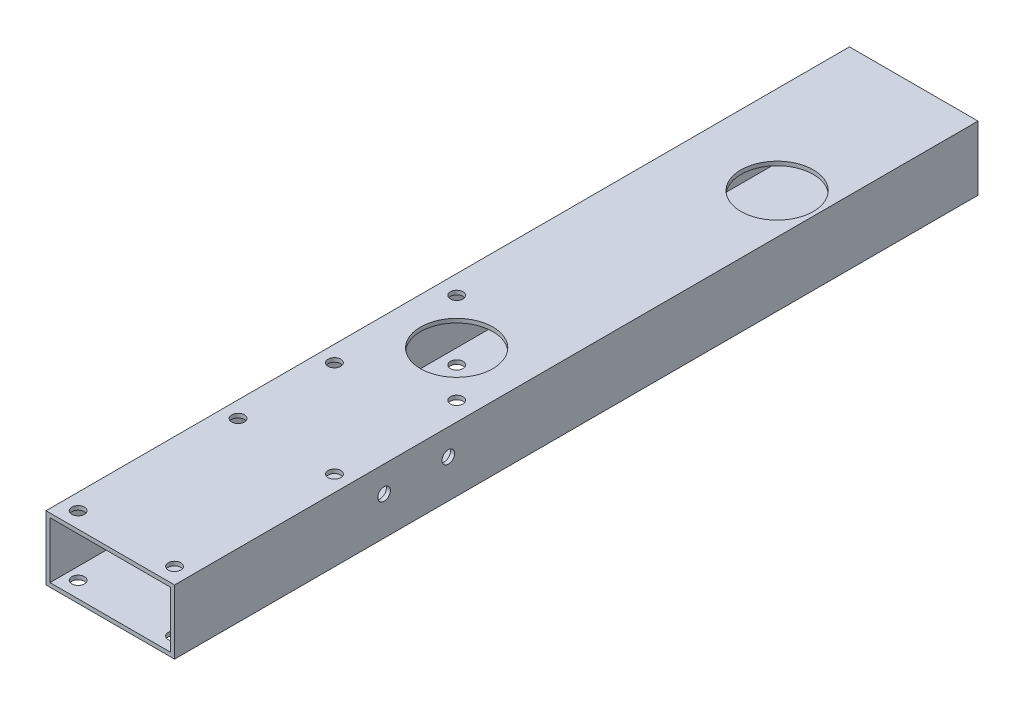
ISO-10303-21;
HEADER;
FILE_DESCRIPTION(('STEP AP214'),'2;1');
FILE_NAME('part.step','',(''),(''),'','','');
FILE_SCHEMA(('AUTOMOTIVE_DESIGN { 1 0 10303 214 1 1 1 1 }'));
ENDSEC;
DATA;
#1=APPLICATION_CONTEXT('core data for automotive mechanical design processes');
#2=APPLICATION_PROTOCOL_DEFINITION('international standard','automotive_design',2000,#1);
#3=PRODUCT_CONTEXT('',#1,'mechanical');
#4=PRODUCT('Part','Part','',(#3));
#5=PRODUCT_RELATED_PRODUCT_CATEGORY('part','',(#4));
#6=PRODUCT_DEFINITION_FORMATION('','',#4);
#7=PRODUCT_DEFINITION_CONTEXT('part definition',#1,'design');
#8=PRODUCT_DEFINITION('design','',#6,#7);
#9=PRODUCT_DEFINITION_SHAPE('','',#8);
#10=(LENGTH_UNIT() NAMED_UNIT(*) SI_UNIT(.MILLI.,.METRE.));
#11=(NAMED_UNIT(*) PLANE_ANGLE_UNIT() SI_UNIT($,.RADIAN.));
#12=(NAMED_UNIT(*) SI_UNIT($,.STERADIAN.) SOLID_ANGLE_UNIT());
#13=UNCERTAINTY_MEASURE_WITH_UNIT(LENGTH_MEASURE(1.E-05),#10,'distance_accuracy_value','');
#14=(GEOMETRIC_REPRESENTATION_CONTEXT(3) GLOBAL_UNCERTAINTY_ASSIGNED_CONTEXT((#13)) GLOBAL_UNIT_ASSIGNED_CONTEXT((#10,
#11,#12)) REPRESENTATION_CONTEXT('',''));
#15=CARTESIAN_POINT('',(0.,0.,0.));
#16=DIRECTION('',(0.,0.,1.));
#17=DIRECTION('',(1.,0.,0.));
#18=AXIS2_PLACEMENT_3D('',#15,#16,#17);
#19=CARTESIAN_POINT('',(0.,0.,158.750000508));
#20=DIRECTION('',(0.,0.,1.));
#21=DIRECTION('',(1.,0.,0.));
#22=AXIS2_PLACEMENT_3D('',#19,#20,#21);
#23=PLANE('',#22);
#24=DIRECTION('',(0.,-1.,0.));
#25=VECTOR('',#24,1.);
#26=CARTESIAN_POINT('',(-25.4,12.7,158.750000508));
#27=LINE('',#26,#25);
#28=CARTESIAN_POINT('',(-25.4,12.7,158.750000508));
#29=VERTEX_POINT('',#28);
#30=CARTESIAN_POINT('',(-25.4,-12.7,158.750000508));
#31=VERTEX_POINT('',#30);
#32=EDGE_CURVE('E118',#29,#31,#27,.T.);
#33=ORIENTED_EDGE('',*,*,#32,.T.);
#34=DIRECTION('',(1.,0.,0.));
#35=VECTOR('',#34,1.);
#36=CARTESIAN_POINT('',(-25.4,-12.7,158.750000508));
#37=LINE('',#36,#35);
#38=CARTESIAN_POINT('',(25.4,-12.7,158.750000508));
#39=VERTEX_POINT('',#38);
#40=EDGE_CURVE('E173',#31,#39,#37,.T.);
#41=ORIENTED_EDGE('',*,*,#40,.T.);
#42=DIRECTION('',(0.,1.,0.));
#43=VECTOR('',#42,1.);
#44=CARTESIAN_POINT('',(25.4,-12.7,158.750000508));
#45=LINE('',#44,#43);
#46=CARTESIAN_POINT('',(25.4,12.7,158.750000508));
#47=VERTEX_POINT('',#46);
#48=EDGE_CURVE('E175',#39,#47,#45,.T.);
#49=ORIENTED_EDGE('',*,*,#48,.T.);
#50=DIRECTION('',(-1.,0.,0.));
#51=VECTOR('',#50,1.);
#52=CARTESIAN_POINT('',(25.4,12.7,158.750000508));
#53=LINE('',#52,#51);
#54=EDGE_CURVE('E177',#47,#29,#53,.T.);
#55=ORIENTED_EDGE('',*,*,#54,.T.);
#56=EDGE_LOOP('',(#33,#41,#49,#55));
#57=FACE_BOUND('',#56,.T.);
#58=DIRECTION('',(1.,0.,0.));
#59=VECTOR('',#58,1.);
#60=CARTESIAN_POINT('',(-23.8125,-11.1125,158.750000508));
#61=LINE('',#60,#59);
#62=CARTESIAN_POINT('',(-23.8125,-11.1125,158.750000508));
#63=VERTEX_POINT('',#62);
#64=CARTESIAN_POINT('',(23.8125,-11.1125,158.750000508));
#65=VERTEX_POINT('',#64);
#66=EDGE_CURVE('E157',#63,#65,#61,.T.);
#67=ORIENTED_EDGE('',*,*,#66,.F.);
#68=DIRECTION('',(0.,-1.,0.));
#69=VECTOR('',#68,1.);
#70=CARTESIAN_POINT('',(-23.8125,11.1125,158.750000508));
#71=LINE('',#70,#69);
#72=CARTESIAN_POINT('',(-23.8125,11.1125,158.750000508));
#73=VERTEX_POINT('',#72);
#74=EDGE_CURVE('E115',#73,#63,#71,.T.);
#75=ORIENTED_EDGE('',*,*,#74,.F.);
#76=DIRECTION('',(-1.,0.,0.));
#77=VECTOR('',#76,1.);
#78=CARTESIAN_POINT('',(23.8125,11.1125,158.750000508));
#79=LINE('',#78,#77);
#80=CARTESIAN_POINT('',(23.8125,11.1125,158.750000508));
#81=VERTEX_POINT('',#80);
#82=EDGE_CURVE('E162',#81,#73,#79,.T.);
#83=ORIENTED_EDGE('',*,*,#82,.F.);
#84=DIRECTION('',(0.,1.,0.));
#85=VECTOR('',#84,1.);
#86=CARTESIAN_POINT('',(23.8125,-11.1125,158.750000508));
#87=LINE('',#86,#85);
#88=EDGE_CURVE('E159',#65,#81,#87,.T.);
#89=ORIENTED_EDGE('',*,*,#88,.F.);
#90=EDGE_LOOP('',(#67,#75,#83,#89));
#91=FACE_BOUND('',#90,.T.);
#92=ADVANCED_FACE('F37',(#57,#91),#23,.T.);
#93=CARTESIAN_POINT('',(-25.4,12.7,158.750000508));
#94=DIRECTION('',(1.,0.,0.));
#95=DIRECTION('',(0.,0.,-1.));
#96=AXIS2_PLACEMENT_3D('',#93,#94,#95);
#97=PLANE('',#96);
#98=CARTESIAN_POINT('',(-25.4,2.42500000000001,50.5496684090159));
#99=DIRECTION('',(-1.,0.,0.));
#100=DIRECTION('',(0.,0.,1.));
#101=AXIS2_PLACEMENT_3D('',#98,#99,#100);
#102=CIRCLE('',#101,2.48919999999999);
#103=CARTESIAN_POINT('',(-25.4,2.42500000000001,53.0388684090159));
#104=VERTEX_POINT('',#103);
#105=EDGE_CURVE('E264',#104,#104,#102,.T.);
#106=ORIENTED_EDGE('',*,*,#105,.F.);
#107=EDGE_LOOP('',(#106));
#108=FACE_BOUND('',#107,.T.);
#109=CARTESIAN_POINT('',(-25.4,2.425,75.9496684090159));
#110=DIRECTION('',(-1.,0.,0.));
#111=DIRECTION('',(0.,0.,1.));
#112=AXIS2_PLACEMENT_3D('',#109,#110,#111);
#113=CIRCLE('',#112,2.48919999999999);
#114=CARTESIAN_POINT('',(-25.4,2.425,78.4388684090159));
#115=VERTEX_POINT('',#114);
#116=EDGE_CURVE('E271',#115,#115,#113,.T.);
#117=ORIENTED_EDGE('',*,*,#116,.F.);
#118=EDGE_LOOP('',(#117));
#119=FACE_BOUND('',#118,.T.);
#120=DIRECTION('',(0.,0.,-1.));
#121=VECTOR('',#120,1.);
#122=CARTESIAN_POINT('',(-25.4,12.7,158.750000508));
#123=LINE('',#122,#121);
#124=CARTESIAN_POINT('',(-25.4,12.7,-158.750000508));
#125=VERTEX_POINT('',#124);
#126=EDGE_CURVE('E179',#29,#125,#123,.T.);
#127=ORIENTED_EDGE('',*,*,#126,.T.);
#128=DIRECTION('',(0.,-1.,0.));
#129=VECTOR('',#128,1.);
#130=CARTESIAN_POINT('',(-25.4,12.7,-158.750000508));
#131=LINE('',#130,#129);
#132=CARTESIAN_POINT('',(-25.4,-12.7,-158.750000508));
#133=VERTEX_POINT('',#132);
#134=EDGE_CURVE('E144',#125,#133,#131,.T.);
#135=ORIENTED_EDGE('',*,*,#134,.T.);
#136=DIRECTION('',(0.,0.,-1.));
#137=VECTOR('',#136,1.);
#138=CARTESIAN_POINT('',(-25.4,-12.7,158.750000508));
#139=LINE('',#138,#137);
#140=EDGE_CURVE('E11',#31,#133,#139,.T.);
#141=ORIENTED_EDGE('',*,*,#140,.F.);
#142=ORIENTED_EDGE('',*,*,#32,.F.);
#143=EDGE_LOOP('',(#127,#135,#141,#142));
#144=FACE_BOUND('',#143,.T.);
#145=ADVANCED_FACE('F39',(#108,#119,#144),#97,.F.);
#146=CARTESIAN_POINT('',(-25.4,-12.7,158.750000508));
#147=DIRECTION('',(0.,1.,0.));
#148=DIRECTION('',(-1.,0.,0.));
#149=AXIS2_PLACEMENT_3D('',#146,#147,#148);
#150=PLANE('',#149);
#151=CARTESIAN_POINT('',(-19.0500000000025,-12.7,51.1130804929902));
#152=DIRECTION('',(0.,1.,0.));
#153=DIRECTION('',(0.,0.,1.));
#154=AXIS2_PLACEMENT_3D('',#151,#152,#153);
#155=CIRCLE('',#154,2.48919999999999);
#156=CARTESIAN_POINT('',(-19.0500000000025,-12.7,53.6022804929902));
#157=VERTEX_POINT('',#156);
#158=EDGE_CURVE('E345',#157,#157,#155,.T.);
#159=ORIENTED_EDGE('',*,*,#158,.T.);
#160=EDGE_LOOP('',(#159));
#161=FACE_BOUND('',#160,.T.);
#162=CARTESIAN_POINT('',(-19.0500000000016,-12.7,89.2130804929903));
#163=DIRECTION('',(0.,1.,0.));
#164=DIRECTION('',(0.,0.,1.));
#165=AXIS2_PLACEMENT_3D('',#162,#163,#164);
#166=CIRCLE('',#165,2.48919999999999);
#167=CARTESIAN_POINT('',(-19.0500000000016,-12.7,91.7022804929903));
#168=VERTEX_POINT('',#167);
#169=EDGE_CURVE('E228',#168,#168,#166,.T.);
#170=ORIENTED_EDGE('',*,*,#169,.T.);
#171=EDGE_LOOP('',(#170));
#172=FACE_BOUND('',#171,.T.);
#173=CARTESIAN_POINT('',(19.0499999999984,-12.7,89.2130804929893));
#174=DIRECTION('',(0.,1.,0.));
#175=DIRECTION('',(0.,0.,1.));
#176=AXIS2_PLACEMENT_3D('',#173,#174,#175);
#177=CIRCLE('',#176,2.48919999999999);
#178=CARTESIAN_POINT('',(19.0499999999984,-12.7,91.7022804929893));
#179=VERTEX_POINT('',#178);
#180=EDGE_CURVE('E224',#179,#179,#177,.T.);
#181=ORIENTED_EDGE('',*,*,#180,.T.);
#182=EDGE_LOOP('',(#181));
#183=FACE_BOUND('',#182,.T.);
#184=CARTESIAN_POINT('',(19.0500000000001,-12.7,152.400000507999));
#185=DIRECTION('',(0.,1.,0.));
#186=DIRECTION('',(0.,0.,1.));
#187=AXIS2_PLACEMENT_3D('',#184,#185,#186);
#188=CIRCLE('',#187,2.48919999999999);
#189=CARTESIAN_POINT('',(19.0500000000001,-12.7,154.889200507999));
#190=VERTEX_POINT('',#189);
#191=EDGE_CURVE('E220',#190,#190,#188,.T.);
#192=ORIENTED_EDGE('',*,*,#191,.T.);
#193=EDGE_LOOP('',(#192));
#194=FACE_BOUND('',#193,.T.);
#195=CARTESIAN_POINT('',(-19.05,-12.7,152.400000508));
#196=DIRECTION('',(0.,1.,0.));
#197=DIRECTION('',(0.,0.,1.));
#198=AXIS2_PLACEMENT_3D('',#195,#196,#197);
#199=CIRCLE('',#198,2.48919999999999);
#200=CARTESIAN_POINT('',(-19.05,-12.7,154.889200508));
#201=VERTEX_POINT('',#200);
#202=EDGE_CURVE('E215',#201,#201,#199,.T.);
#203=ORIENTED_EDGE('',*,*,#202,.T.);
#204=EDGE_LOOP('',(#203));
#205=FACE_BOUND('',#204,.T.);
#206=CARTESIAN_POINT('',(-17.9605122421383,-12.7,3.90318574478582));
#207=DIRECTION('',(0.,1.,0.));
#208=DIRECTION('',(0.,0.,1.));
#209=AXIS2_PLACEMENT_3D('',#206,#207,#208);
#210=CIRCLE('',#209,2.48919999999999);
#211=CARTESIAN_POINT('',(-17.9605122421383,-12.7,6.39238574478581));
#212=VERTEX_POINT('',#211);
#213=EDGE_CURVE('E200',#212,#212,#210,.T.);
#214=ORIENTED_EDGE('',*,*,#213,.T.);
#215=EDGE_LOOP('',(#214));
#216=FACE_BOUND('',#215,.T.);
#217=CARTESIAN_POINT('',(17.9605122421383,-12.7,39.8242102290625));
#218=DIRECTION('',(0.,1.,0.));
#219=DIRECTION('',(0.,0.,1.));
#220=AXIS2_PLACEMENT_3D('',#217,#218,#219);
#221=CIRCLE('',#220,2.48919999999999);
#222=CARTESIAN_POINT('',(17.9605122421383,-12.7,42.3134102290625));
#223=VERTEX_POINT('',#222);
#224=EDGE_CURVE('E195',#223,#223,#221,.T.);
#225=ORIENTED_EDGE('',*,*,#224,.T.);
#226=EDGE_LOOP('',(#225));
#227=FACE_BOUND('',#226,.T.);
#228=CARTESIAN_POINT('',(9.52500000000001,-12.7,-95.250000508));
#229=DIRECTION('',(0.,1.,0.));
#230=DIRECTION('',(-1.,0.,0.));
#231=AXIS2_PLACEMENT_3D('',#228,#229,#230);
#232=CIRCLE('',#231,14.2875);
#233=CARTESIAN_POINT('',(-4.7625,-12.7,-95.250000508));
#234=VERTEX_POINT('',#233);
#235=EDGE_CURVE('E136',#234,#234,#232,.T.);
#236=ORIENTED_EDGE('',*,*,#235,.T.);
#237=EDGE_LOOP('',(#236));
#238=FACE_BOUND('',#237,.T.);
#239=CARTESIAN_POINT('',(0.,-12.7,21.8636979869242));
#240=DIRECTION('',(0.,1.,0.));
#241=DIRECTION('',(-1.,0.,0.));
#242=AXIS2_PLACEMENT_3D('',#239,#240,#241);
#243=CIRCLE('',#242,14.2875);
#244=CARTESIAN_POINT('',(-14.2875,-12.7,21.8636979869242));
#245=VERTEX_POINT('',#244);
#246=EDGE_CURVE('E190',#245,#245,#243,.T.);
#247=ORIENTED_EDGE('',*,*,#246,.T.);
#248=EDGE_LOOP('',(#247));
#249=FACE_BOUND('',#248,.T.);
#250=ORIENTED_EDGE('',*,*,#140,.T.);
#251=DIRECTION('',(1.,0.,0.));
#252=VECTOR('',#251,1.);
#253=CARTESIAN_POINT('',(-25.4,-12.7,-158.750000508));
#254=LINE('',#253,#252);
#255=CARTESIAN_POINT('',(25.4,-12.7,-158.750000508));
#256=VERTEX_POINT('',#255);
#257=EDGE_CURVE('E147',#133,#256,#254,.T.);
#258=ORIENTED_EDGE('',*,*,#257,.T.);
#259=DIRECTION('',(0.,0.,-1.));
#260=VECTOR('',#259,1.);
#261=CARTESIAN_POINT('',(25.4,-12.7,158.750000508));
#262=LINE('',#261,#260);
#263=EDGE_CURVE('E46',#39,#256,#262,.T.);
#264=ORIENTED_EDGE('',*,*,#263,.F.);
#265=ORIENTED_EDGE('',*,*,#40,.F.);
#266=EDGE_LOOP('',(#250,#258,#264,#265));
#267=FACE_BOUND('',#266,.T.);
#268=ADVANCED_FACE('F302',(#161,#172,#183,#194,#205,#216,#227,#238,#249,#267),#150,.F.);
#269=CARTESIAN_POINT('',(25.4,-12.7,158.750000508));
#270=DIRECTION('',(-1.,0.,0.));
#271=DIRECTION('',(0.,0.,1.));
#272=AXIS2_PLACEMENT_3D('',#269,#270,#271);
#273=PLANE('',#272);
#274=CARTESIAN_POINT('',(25.4,2.42500000000001,50.5496684090159));
#275=DIRECTION('',(-1.,0.,0.));
#276=DIRECTION('',(0.,0.,1.));
#277=AXIS2_PLACEMENT_3D('',#274,#275,#276);
#278=CIRCLE('',#277,2.48919999999998);
#279=CARTESIAN_POINT('',(25.4,2.42500000000001,53.0388684090159));
#280=VERTEX_POINT('',#279);
#281=EDGE_CURVE('E210',#280,#280,#278,.T.);
#282=ORIENTED_EDGE('',*,*,#281,.T.);
#283=EDGE_LOOP('',(#282));
#284=FACE_BOUND('',#283,.T.);
#285=CARTESIAN_POINT('',(25.4,2.425,75.9496684090159));
#286=DIRECTION('',(-1.,0.,0.));
#287=DIRECTION('',(0.,0.,1.));
#288=AXIS2_PLACEMENT_3D('',#285,#286,#287);
#289=CIRCLE('',#288,2.48919999999998);
#290=CARTESIAN_POINT('',(25.4,2.425,78.4388684090159));
#291=VERTEX_POINT('',#290);
#292=EDGE_CURVE('E205',#291,#291,#289,.T.);
#293=ORIENTED_EDGE('',*,*,#292,.T.);
#294=EDGE_LOOP('',(#293));
#295=FACE_BOUND('',#294,.T.);
#296=ORIENTED_EDGE('',*,*,#263,.T.);
#297=DIRECTION('',(0.,1.,0.));
#298=VECTOR('',#297,1.);
#299=CARTESIAN_POINT('',(25.4,-12.7,-158.750000508));
#300=LINE('',#299,#298);
#301=CARTESIAN_POINT('',(25.4,12.7,-158.750000508));
#302=VERTEX_POINT('',#301);
#303=EDGE_CURVE('E150',#256,#302,#300,.T.);
#304=ORIENTED_EDGE('',*,*,#303,.T.);
#305=DIRECTION('',(0.,0.,-1.));
#306=VECTOR('',#305,1.);
#307=CARTESIAN_POINT('',(25.4,12.7,158.750000508));
#308=LINE('',#307,#306);
#309=EDGE_CURVE('E181',#47,#302,#308,.T.);
#310=ORIENTED_EDGE('',*,*,#309,.F.);
#311=ORIENTED_EDGE('',*,*,#48,.F.);
#312=EDGE_LOOP('',(#296,#304,#310,#311));
#313=FACE_BOUND('',#312,.T.);
#314=ADVANCED_FACE('F335',(#284,#295,#313),#273,.F.);
#315=CARTESIAN_POINT('',(25.4,12.7,158.750000508));
#316=DIRECTION('',(0.,-1.,0.));
#317=DIRECTION('',(1.,0.,0.));
#318=AXIS2_PLACEMENT_3D('',#315,#316,#317);
#319=PLANE('',#318);
#320=CARTESIAN_POINT('',(-19.0500000000025,12.7,51.1130804929902));
#321=DIRECTION('',(0.,1.,0.));
#322=DIRECTION('',(0.,0.,1.));
#323=AXIS2_PLACEMENT_3D('',#320,#321,#322);
#324=CIRCLE('',#323,2.48919999999999);
#325=CARTESIAN_POINT('',(-19.0500000000025,12.7,53.6022804929902));
#326=VERTEX_POINT('',#325);
#327=EDGE_CURVE('E418',#326,#326,#324,.T.);
#328=ORIENTED_EDGE('',*,*,#327,.F.);
#329=EDGE_LOOP('',(#328));
#330=FACE_BOUND('',#329,.T.);
#331=CARTESIAN_POINT('',(-19.0500000000016,12.7,89.2130804929903));
#332=DIRECTION('',(0.,1.,0.));
#333=DIRECTION('',(0.,0.,1.));
#334=AXIS2_PLACEMENT_3D('',#331,#332,#333);
#335=CIRCLE('',#334,2.48919999999999);
#336=CARTESIAN_POINT('',(-19.0500000000016,12.7,91.7022804929903));
#337=VERTEX_POINT('',#336);
#338=EDGE_CURVE('E235',#337,#337,#335,.T.);
#339=ORIENTED_EDGE('',*,*,#338,.F.);
#340=EDGE_LOOP('',(#339));
#341=FACE_BOUND('',#340,.T.);
#342=CARTESIAN_POINT('',(19.0499999999984,12.7,89.2130804929893));
#343=DIRECTION('',(0.,1.,0.));
#344=DIRECTION('',(0.,0.,1.));
#345=AXIS2_PLACEMENT_3D('',#342,#343,#344);
#346=CIRCLE('',#345,2.48919999999999);
#347=CARTESIAN_POINT('',(19.0499999999984,12.7,91.7022804929893));
#348=VERTEX_POINT('',#347);
#349=EDGE_CURVE('E232',#348,#348,#346,.T.);
#350=ORIENTED_EDGE('',*,*,#349,.F.);
#351=EDGE_LOOP('',(#350));
#352=FACE_BOUND('',#351,.T.);
#353=CARTESIAN_POINT('',(19.0500000000001,12.7,152.400000507999));
#354=DIRECTION('',(0.,1.,0.));
#355=DIRECTION('',(0.,0.,1.));
#356=AXIS2_PLACEMENT_3D('',#353,#354,#355);
#357=CIRCLE('',#356,2.48919999999999);
#358=CARTESIAN_POINT('',(19.0500000000001,12.7,154.889200507999));
#359=VERTEX_POINT('',#358);
#360=EDGE_CURVE('E250',#359,#359,#357,.T.);
#361=ORIENTED_EDGE('',*,*,#360,.F.);
#362=EDGE_LOOP('',(#361));
#363=FACE_BOUND('',#362,.T.);
#364=CARTESIAN_POINT('',(-19.05,12.7,152.400000508));
#365=DIRECTION('',(0.,1.,0.));
#366=DIRECTION('',(0.,0.,1.));
#367=AXIS2_PLACEMENT_3D('',#364,#365,#366);
#368=CIRCLE('',#367,2.48919999999999);
#369=CARTESIAN_POINT('',(-19.05,12.7,154.889200508));
#370=VERTEX_POINT('',#369);
#371=EDGE_CURVE('E257',#370,#370,#368,.T.);
#372=ORIENTED_EDGE('',*,*,#371,.F.);
#373=EDGE_LOOP('',(#372));
#374=FACE_BOUND('',#373,.T.);
#375=CARTESIAN_POINT('',(-17.9605122421383,12.7,3.90318574478582));
#376=DIRECTION('',(0.,1.,0.));
#377=DIRECTION('',(0.,0.,1.));
#378=AXIS2_PLACEMENT_3D('',#375,#376,#377);
#379=CIRCLE('',#378,2.48919999999999);
#380=CARTESIAN_POINT('',(-17.9605122421383,12.7,6.39238574478581));
#381=VERTEX_POINT('',#380);
#382=EDGE_CURVE('E278',#381,#381,#379,.T.);
#383=ORIENTED_EDGE('',*,*,#382,.F.);
#384=EDGE_LOOP('',(#383));
#385=FACE_BOUND('',#384,.T.);
#386=CARTESIAN_POINT('',(17.9605122421383,12.7,39.8242102290625));
#387=DIRECTION('',(0.,1.,0.));
#388=DIRECTION('',(0.,0.,1.));
#389=AXIS2_PLACEMENT_3D('',#386,#387,#388);
#390=CIRCLE('',#389,2.48919999999999);
#391=CARTESIAN_POINT('',(17.9605122421383,12.7,42.3134102290625));
#392=VERTEX_POINT('',#391);
#393=EDGE_CURVE('E285',#392,#392,#390,.T.);
#394=ORIENTED_EDGE('',*,*,#393,.F.);
#395=EDGE_LOOP('',(#394));
#396=FACE_BOUND('',#395,.T.);
#397=CARTESIAN_POINT('',(9.52500000000001,12.7,-95.250000508));
#398=DIRECTION('',(0.,1.,0.));
#399=DIRECTION('',(-1.,0.,0.));
#400=AXIS2_PLACEMENT_3D('',#397,#398,#399);
#401=CIRCLE('',#400,14.2875);
#402=CARTESIAN_POINT('',(-4.7625,12.7,-95.250000508));
#403=VERTEX_POINT('',#402);
#404=EDGE_CURVE('E188',#403,#403,#401,.T.);
#405=ORIENTED_EDGE('',*,*,#404,.F.);
#406=EDGE_LOOP('',(#405));
#407=FACE_BOUND('',#406,.T.);
#408=CARTESIAN_POINT('',(0.,12.7,21.8636979869242));
#409=DIRECTION('',(0.,1.,0.));
#410=DIRECTION('',(-1.,0.,0.));
#411=AXIS2_PLACEMENT_3D('',#408,#409,#410);
#412=CIRCLE('',#411,14.2875);
#413=CARTESIAN_POINT('',(-14.2875,12.7,21.8636979869242));
#414=VERTEX_POINT('',#413);
#415=EDGE_CURVE('E292',#414,#414,#412,.T.);
#416=ORIENTED_EDGE('',*,*,#415,.F.);
#417=EDGE_LOOP('',(#416));
#418=FACE_BOUND('',#417,.T.);
#419=ORIENTED_EDGE('',*,*,#309,.T.);
#420=DIRECTION('',(-1.,0.,0.));
#421=VECTOR('',#420,1.);
#422=CARTESIAN_POINT('',(25.4,12.7,-158.750000508));
#423=LINE('',#422,#421);
#424=EDGE_CURVE('E153',#302,#125,#423,.T.);
#425=ORIENTED_EDGE('',*,*,#424,.T.);
#426=ORIENTED_EDGE('',*,*,#126,.F.);
#427=ORIENTED_EDGE('',*,*,#54,.F.);
#428=EDGE_LOOP('',(#419,#425,#426,#427));
#429=FACE_BOUND('',#428,.T.);
#430=ADVANCED_FACE('F332',(#330,#341,#352,#363,#374,#385,#396,#407,#418,#429),#319,.F.);
#431=CARTESIAN_POINT('',(-23.8125,11.1125,158.750000508));
#432=DIRECTION('',(1.,0.,0.));
#433=DIRECTION('',(0.,1.,0.));
#434=AXIS2_PLACEMENT_3D('',#431,#432,#433);
#435=PLANE('',#434);
#436=CARTESIAN_POINT('',(-23.8125,2.42500000000001,50.5496684090159));
#437=DIRECTION('',(1.,0.,0.));
#438=DIRECTION('',(0.,1.,0.));
#439=AXIS2_PLACEMENT_3D('',#436,#437,#438);
#440=CIRCLE('',#439,2.48919999999998);
#441=CARTESIAN_POINT('',(-23.8125,4.9142,50.5496684090159));
#442=VERTEX_POINT('',#441);
#443=EDGE_CURVE('E209',#442,#442,#440,.T.);
#444=ORIENTED_EDGE('',*,*,#443,.F.);
#445=EDGE_LOOP('',(#444));
#446=FACE_BOUND('',#445,.T.);
#447=CARTESIAN_POINT('',(-23.8125,2.425,75.9496684090159));
#448=DIRECTION('',(1.,0.,0.));
#449=DIRECTION('',(0.,1.,0.));
#450=AXIS2_PLACEMENT_3D('',#447,#448,#449);
#451=CIRCLE('',#450,2.48919999999998);
#452=CARTESIAN_POINT('',(-23.8125,4.91419999999999,75.9496684090159));
#453=VERTEX_POINT('',#452);
#454=EDGE_CURVE('E201',#453,#453,#451,.T.);
#455=ORIENTED_EDGE('',*,*,#454,.F.);
#456=EDGE_LOOP('',(#455));
#457=FACE_BOUND('',#456,.T.);
#458=DIRECTION('',(0.,0.,-1.));
#459=VECTOR('',#458,1.);
#460=CARTESIAN_POINT('',(-23.8125,-11.1125,158.750000508));
#461=LINE('',#460,#459);
#462=CARTESIAN_POINT('',(-23.8125,-11.1125,-158.750000508));
#463=VERTEX_POINT('',#462);
#464=EDGE_CURVE('E107',#63,#463,#461,.T.);
#465=ORIENTED_EDGE('',*,*,#464,.T.);
#466=DIRECTION('',(0.,-1.,0.));
#467=VECTOR('',#466,1.);
#468=CARTESIAN_POINT('',(-23.8125,11.1125,-158.750000508));
#469=LINE('',#468,#467);
#470=CARTESIAN_POINT('',(-23.8125,11.1125,-158.750000508));
#471=VERTEX_POINT('',#470);
#472=EDGE_CURVE('E112',#471,#463,#469,.T.);
#473=ORIENTED_EDGE('',*,*,#472,.F.);
#474=DIRECTION('',(0.,0.,-1.));
#475=VECTOR('',#474,1.);
#476=CARTESIAN_POINT('',(-23.8125,11.1125,158.750000508));
#477=LINE('',#476,#475);
#478=EDGE_CURVE('E164',#73,#471,#477,.T.);
#479=ORIENTED_EDGE('',*,*,#478,.F.);
#480=ORIENTED_EDGE('',*,*,#74,.T.);
#481=EDGE_LOOP('',(#465,#473,#479,#480));
#482=FACE_BOUND('',#481,.T.);
#483=ADVANCED_FACE('F109',(#446,#457,#482),#435,.T.);
#484=CARTESIAN_POINT('',(-23.8125,-11.1125,158.750000508));
#485=DIRECTION('',(0.,1.,0.));
#486=DIRECTION('',(0.,0.,1.));
#487=AXIS2_PLACEMENT_3D('',#484,#485,#486);
#488=PLANE('',#487);
#489=CARTESIAN_POINT('',(-19.0500000000025,-11.1125,51.1130804929902));
#490=DIRECTION('',(0.,1.,0.));
#491=DIRECTION('',(0.,0.,1.));
#492=AXIS2_PLACEMENT_3D('',#489,#490,#491);
#493=CIRCLE('',#492,2.48919999999999);
#494=CARTESIAN_POINT('',(-19.0500000000025,-11.1125,53.6022804929902));
#495=VERTEX_POINT('',#494);
#496=EDGE_CURVE('E240',#495,#495,#493,.T.);
#497=ORIENTED_EDGE('',*,*,#496,.F.);
#498=EDGE_LOOP('',(#497));
#499=FACE_BOUND('',#498,.T.);
#500=CARTESIAN_POINT('',(-19.0500000000016,-11.1125,89.2130804929903));
#501=DIRECTION('',(0.,1.,0.));
#502=DIRECTION('',(0.,0.,1.));
#503=AXIS2_PLACEMENT_3D('',#500,#501,#502);
#504=CIRCLE('',#503,2.48919999999999);
#505=CARTESIAN_POINT('',(-19.0500000000016,-11.1125,91.7022804929903));
#506=VERTEX_POINT('',#505);
#507=EDGE_CURVE('E227',#506,#506,#504,.T.);
#508=ORIENTED_EDGE('',*,*,#507,.F.);
#509=EDGE_LOOP('',(#508));
#510=FACE_BOUND('',#509,.T.);
#511=CARTESIAN_POINT('',(19.0499999999984,-11.1125,89.2130804929893));
#512=DIRECTION('',(0.,1.,0.));
#513=DIRECTION('',(0.,0.,1.));
#514=AXIS2_PLACEMENT_3D('',#511,#512,#513);
#515=CIRCLE('',#514,2.48919999999999);
#516=CARTESIAN_POINT('',(19.0499999999984,-11.1125,91.7022804929893));
#517=VERTEX_POINT('',#516);
#518=EDGE_CURVE('E223',#517,#517,#515,.T.);
#519=ORIENTED_EDGE('',*,*,#518,.F.);
#520=EDGE_LOOP('',(#519));
#521=FACE_BOUND('',#520,.T.);
#522=CARTESIAN_POINT('',(19.0500000000001,-11.1125,152.400000507999));
#523=DIRECTION('',(0.,1.,0.));
#524=DIRECTION('',(0.,0.,1.));
#525=AXIS2_PLACEMENT_3D('',#522,#523,#524);
#526=CIRCLE('',#525,2.48919999999999);
#527=CARTESIAN_POINT('',(19.0500000000001,-11.1125,154.889200507999));
#528=VERTEX_POINT('',#527);
#529=EDGE_CURVE('E216',#528,#528,#526,.T.);
#530=ORIENTED_EDGE('',*,*,#529,.F.);
#531=EDGE_LOOP('',(#530));
#532=FACE_BOUND('',#531,.T.);
#533=CARTESIAN_POINT('',(-19.05,-11.1125,152.400000508));
#534=DIRECTION('',(0.,1.,0.));
#535=DIRECTION('',(0.,0.,1.));
#536=AXIS2_PLACEMENT_3D('',#533,#534,#535);
#537=CIRCLE('',#536,2.48919999999999);
#538=CARTESIAN_POINT('',(-19.05,-11.1125,154.889200508));
#539=VERTEX_POINT('',#538);
#540=EDGE_CURVE('E214',#539,#539,#537,.T.);
#541=ORIENTED_EDGE('',*,*,#540,.F.);
#542=EDGE_LOOP('',(#541));
#543=FACE_BOUND('',#542,.T.);
#544=CARTESIAN_POINT('',(-17.9605122421383,-11.1125,3.90318574478582));
#545=DIRECTION('',(0.,1.,0.));
#546=DIRECTION('',(0.,0.,1.));
#547=AXIS2_PLACEMENT_3D('',#544,#545,#546);
#548=CIRCLE('',#547,2.48919999999999);
#549=CARTESIAN_POINT('',(-17.9605122421383,-11.1125,6.39238574478581));
#550=VERTEX_POINT('',#549);
#551=EDGE_CURVE('E196',#550,#550,#548,.T.);
#552=ORIENTED_EDGE('',*,*,#551,.F.);
#553=EDGE_LOOP('',(#552));
#554=FACE_BOUND('',#553,.T.);
#555=CARTESIAN_POINT('',(17.9605122421383,-11.1125,39.8242102290625));
#556=DIRECTION('',(0.,1.,0.));
#557=DIRECTION('',(0.,0.,1.));
#558=AXIS2_PLACEMENT_3D('',#555,#556,#557);
#559=CIRCLE('',#558,2.48919999999999);
#560=CARTESIAN_POINT('',(17.9605122421383,-11.1125,42.3134102290625));
#561=VERTEX_POINT('',#560);
#562=EDGE_CURVE('E194',#561,#561,#559,.T.);
#563=ORIENTED_EDGE('',*,*,#562,.F.);
#564=EDGE_LOOP('',(#563));
#565=FACE_BOUND('',#564,.T.);
#566=CARTESIAN_POINT('',(0.,-11.1125,21.8636979869242));
#567=DIRECTION('',(0.,1.,0.));
#568=DIRECTION('',(0.,0.,1.));
#569=AXIS2_PLACEMENT_3D('',#566,#567,#568);
#570=CIRCLE('',#569,14.2875);
#571=CARTESIAN_POINT('',(0.,-11.1125,36.1511979869242));
#572=VERTEX_POINT('',#571);
#573=EDGE_CURVE('E187',#572,#572,#570,.T.);
#574=ORIENTED_EDGE('',*,*,#573,.F.);
#575=EDGE_LOOP('',(#574));
#576=FACE_BOUND('',#575,.T.);
#577=DIRECTION('',(0.,0.,-1.));
#578=VECTOR('',#577,1.);
#579=CARTESIAN_POINT('',(23.8125,-11.1125,158.750000508));
#580=LINE('',#579,#578);
#581=CARTESIAN_POINT('',(23.8125,-11.1125,-95.250000508));
#582=VERTEX_POINT('',#581);
#583=EDGE_CURVE('E119',#65,#582,#580,.T.);
#584=ORIENTED_EDGE('',*,*,#583,.T.);
#585=CARTESIAN_POINT('',(9.52500000000001,-11.1125,-95.250000508));
#586=DIRECTION('',(0.,1.,0.));
#587=DIRECTION('',(0.,0.,1.));
#588=AXIS2_PLACEMENT_3D('',#585,#586,#587);
#589=CIRCLE('',#588,14.2875);
#590=EDGE_CURVE('E52',#582,#582,#589,.T.);
#591=ORIENTED_EDGE('',*,*,#590,.F.);
#592=CARTESIAN_POINT('',(23.8125,-11.1125,-158.750000508));
#593=VERTEX_POINT('',#592);
#594=EDGE_CURVE('E126',#582,#593,#580,.T.);
#595=ORIENTED_EDGE('',*,*,#594,.T.);
#596=DIRECTION('',(1.,0.,0.));
#597=VECTOR('',#596,1.);
#598=CARTESIAN_POINT('',(-23.8125,-11.1125,-158.750000508));
#599=LINE('',#598,#597);
#600=EDGE_CURVE('E122',#463,#593,#599,.T.);
#601=ORIENTED_EDGE('',*,*,#600,.F.);
#602=ORIENTED_EDGE('',*,*,#464,.F.);
#603=ORIENTED_EDGE('',*,*,#66,.T.);
#604=EDGE_LOOP('',(#584,#591,#595,#601,#602,#603));
#605=FACE_BOUND('',#604,.T.);
#606=ADVANCED_FACE('F124',(#499,#510,#521,#532,#543,#554,#565,#576,#605),#488,.T.);
#607=CARTESIAN_POINT('',(23.8125,-11.1125,158.750000508));
#608=DIRECTION('',(-1.,0.,0.));
#609=DIRECTION('',(0.,0.,1.));
#610=AXIS2_PLACEMENT_3D('',#607,#608,#609);
#611=PLANE('',#610);
#612=CARTESIAN_POINT('',(23.8125,2.42500000000001,50.5496684090159));
#613=DIRECTION('',(-1.,0.,0.));
#614=DIRECTION('',(0.,0.,1.));
#615=AXIS2_PLACEMENT_3D('',#612,#613,#614);
#616=CIRCLE('',#615,2.48919999999998);
#617=CARTESIAN_POINT('',(23.8125,2.42500000000001,53.0388684090159));
#618=VERTEX_POINT('',#617);
#619=EDGE_CURVE('E206',#618,#618,#616,.T.);
#620=ORIENTED_EDGE('',*,*,#619,.F.);
#621=EDGE_LOOP('',(#620));
#622=FACE_BOUND('',#621,.T.);
#623=CARTESIAN_POINT('',(23.8125,2.425,75.9496684090159));
#624=DIRECTION('',(-1.,0.,0.));
#625=DIRECTION('',(0.,0.,1.));
#626=AXIS2_PLACEMENT_3D('',#623,#624,#625);
#627=CIRCLE('',#626,2.48919999999998);
#628=CARTESIAN_POINT('',(23.8125,2.425,78.4388684090159));
#629=VERTEX_POINT('',#628);
#630=EDGE_CURVE('E204',#629,#629,#627,.T.);
#631=ORIENTED_EDGE('',*,*,#630,.F.);
#632=EDGE_LOOP('',(#631));
#633=FACE_BOUND('',#632,.T.);
#634=DIRECTION('',(0.,0.,-1.));
#635=VECTOR('',#634,1.);
#636=CARTESIAN_POINT('',(23.8125,11.1125,158.750000508));
#637=LINE('',#636,#635);
#638=CARTESIAN_POINT('',(23.8125,11.1125,-95.250000508));
#639=VERTEX_POINT('',#638);
#640=EDGE_CURVE('E167',#81,#639,#637,.T.);
#641=ORIENTED_EDGE('',*,*,#640,.T.);
#642=CARTESIAN_POINT('',(23.8125,11.1125,-158.750000508));
#643=VERTEX_POINT('',#642);
#644=EDGE_CURVE('E166',#639,#643,#637,.T.);
#645=ORIENTED_EDGE('',*,*,#644,.T.);
#646=DIRECTION('',(0.,1.,0.));
#647=VECTOR('',#646,1.);
#648=CARTESIAN_POINT('',(23.8125,-11.1125,-158.750000508));
#649=LINE('',#648,#647);
#650=EDGE_CURVE('E130',#593,#643,#649,.T.);
#651=ORIENTED_EDGE('',*,*,#650,.F.);
#652=ORIENTED_EDGE('',*,*,#594,.F.);
#653=ORIENTED_EDGE('',*,*,#583,.F.);
#654=ORIENTED_EDGE('',*,*,#88,.T.);
#655=EDGE_LOOP('',(#641,#645,#651,#652,#653,#654));
#656=FACE_BOUND('',#655,.T.);
#657=ADVANCED_FACE('F427',(#622,#633,#656),#611,.T.);
#658=CARTESIAN_POINT('',(23.8125,11.1125,158.750000508));
#659=DIRECTION('',(0.,-1.,0.));
#660=DIRECTION('',(0.,0.,-1.));
#661=AXIS2_PLACEMENT_3D('',#658,#659,#660);
#662=PLANE('',#661);
#663=CARTESIAN_POINT('',(-19.0500000000025,11.1125,51.1130804929902));
#664=DIRECTION('',(0.,-1.,0.));
#665=DIRECTION('',(0.,0.,-1.));
#666=AXIS2_PLACEMENT_3D('',#663,#664,#665);
#667=CIRCLE('',#666,2.48919999999999);
#668=CARTESIAN_POINT('',(-19.0500000000025,11.1125,48.6238804929902));
#669=VERTEX_POINT('',#668);
#670=EDGE_CURVE('E41',#669,#669,#667,.T.);
#671=ORIENTED_EDGE('',*,*,#670,.F.);
#672=EDGE_LOOP('',(#671));
#673=FACE_BOUND('',#672,.T.);
#674=CARTESIAN_POINT('',(-19.0500000000016,11.1125,89.2130804929903));
#675=DIRECTION('',(0.,-1.,0.));
#676=DIRECTION('',(0.,0.,-1.));
#677=AXIS2_PLACEMENT_3D('',#674,#675,#676);
#678=CIRCLE('',#677,2.48919999999999);
#679=CARTESIAN_POINT('',(-19.0500000000016,11.1125,86.7238804929903));
#680=VERTEX_POINT('',#679);
#681=EDGE_CURVE('E225',#680,#680,#678,.T.);
#682=ORIENTED_EDGE('',*,*,#681,.F.);
#683=EDGE_LOOP('',(#682));
#684=FACE_BOUND('',#683,.T.);
#685=CARTESIAN_POINT('',(19.0499999999984,11.1125,89.2130804929893));
#686=DIRECTION('',(0.,-1.,0.));
#687=DIRECTION('',(0.,0.,-1.));
#688=AXIS2_PLACEMENT_3D('',#685,#686,#687);
#689=CIRCLE('',#688,2.48919999999999);
#690=CARTESIAN_POINT('',(19.0499999999984,11.1125,86.7238804929893));
#691=VERTEX_POINT('',#690);
#692=EDGE_CURVE('E221',#691,#691,#689,.T.);
#693=ORIENTED_EDGE('',*,*,#692,.F.);
#694=EDGE_LOOP('',(#693));
#695=FACE_BOUND('',#694,.T.);
#696=CARTESIAN_POINT('',(19.0500000000001,11.1125,152.400000507999));
#697=DIRECTION('',(0.,-1.,0.));
#698=DIRECTION('',(0.,0.,-1.));
#699=AXIS2_PLACEMENT_3D('',#696,#697,#698);
#700=CIRCLE('',#699,2.48919999999999);
#701=CARTESIAN_POINT('',(19.0500000000001,11.1125,149.910800507999));
#702=VERTEX_POINT('',#701);
#703=EDGE_CURVE('E219',#702,#702,#700,.T.);
#704=ORIENTED_EDGE('',*,*,#703,.F.);
#705=EDGE_LOOP('',(#704));
#706=FACE_BOUND('',#705,.T.);
#707=CARTESIAN_POINT('',(-19.05,11.1125,152.400000508));
#708=DIRECTION('',(0.,-1.,0.));
#709=DIRECTION('',(0.,0.,-1.));
#710=AXIS2_PLACEMENT_3D('',#707,#708,#709);
#711=CIRCLE('',#710,2.48919999999999);
#712=CARTESIAN_POINT('',(-19.05,11.1125,149.910800508));
#713=VERTEX_POINT('',#712);
#714=EDGE_CURVE('E211',#713,#713,#711,.T.);
#715=ORIENTED_EDGE('',*,*,#714,.F.);
#716=EDGE_LOOP('',(#715));
#717=FACE_BOUND('',#716,.T.);
#718=CARTESIAN_POINT('',(-17.9605122421383,11.1125,3.90318574478582));
#719=DIRECTION('',(0.,-1.,0.));
#720=DIRECTION('',(0.,0.,-1.));
#721=AXIS2_PLACEMENT_3D('',#718,#719,#720);
#722=CIRCLE('',#721,2.48919999999999);
#723=CARTESIAN_POINT('',(-17.9605122421383,11.1125,1.41398574478583));
#724=VERTEX_POINT('',#723);
#725=EDGE_CURVE('E199',#724,#724,#722,.T.);
#726=ORIENTED_EDGE('',*,*,#725,.F.);
#727=EDGE_LOOP('',(#726));
#728=FACE_BOUND('',#727,.T.);
#729=CARTESIAN_POINT('',(17.9605122421383,11.1125,39.8242102290625));
#730=DIRECTION('',(0.,-1.,0.));
#731=DIRECTION('',(0.,0.,-1.));
#732=AXIS2_PLACEMENT_3D('',#729,#730,#731);
#733=CIRCLE('',#732,2.48919999999999);
#734=CARTESIAN_POINT('',(17.9605122421383,11.1125,37.3350102290625));
#735=VERTEX_POINT('',#734);
#736=EDGE_CURVE('E191',#735,#735,#733,.T.);
#737=ORIENTED_EDGE('',*,*,#736,.F.);
#738=EDGE_LOOP('',(#737));
#739=FACE_BOUND('',#738,.T.);
#740=CARTESIAN_POINT('',(0.,11.1125,21.8636979869242));
#741=DIRECTION('',(0.,-1.,0.));
#742=DIRECTION('',(0.,0.,-1.));
#743=AXIS2_PLACEMENT_3D('',#740,#741,#742);
#744=CIRCLE('',#743,14.2875);
#745=CARTESIAN_POINT('',(0.,11.1125,7.57619798692415));
#746=VERTEX_POINT('',#745);
#747=EDGE_CURVE('E184',#746,#746,#744,.T.);
#748=ORIENTED_EDGE('',*,*,#747,.F.);
#749=EDGE_LOOP('',(#748));
#750=FACE_BOUND('',#749,.T.);
#751=ORIENTED_EDGE('',*,*,#644,.F.);
#752=CARTESIAN_POINT('',(9.52500000000001,11.1125,-95.250000508));
#753=DIRECTION('',(0.,-1.,0.));
#754=DIRECTION('',(0.,0.,-1.));
#755=AXIS2_PLACEMENT_3D('',#752,#753,#754);
#756=CIRCLE('',#755,14.2875);
#757=EDGE_CURVE('E57',#639,#639,#756,.T.);
#758=ORIENTED_EDGE('',*,*,#757,.F.);
#759=ORIENTED_EDGE('',*,*,#640,.F.);
#760=ORIENTED_EDGE('',*,*,#82,.T.);
#761=ORIENTED_EDGE('',*,*,#478,.T.);
#762=DIRECTION('',(-1.,0.,0.));
#763=VECTOR('',#762,1.);
#764=CARTESIAN_POINT('',(23.8125,11.1125,-158.750000508));
#765=LINE('',#764,#763);
#766=EDGE_CURVE('E135',#643,#471,#765,.T.);
#767=ORIENTED_EDGE('',*,*,#766,.F.);
#768=EDGE_LOOP('',(#751,#758,#759,#760,#761,#767));
#769=FACE_BOUND('',#768,.T.);
#770=ADVANCED_FACE('F607',(#673,#684,#695,#706,#717,#728,#739,#750,#769),#662,.T.);
#771=CARTESIAN_POINT('',(0.,0.,-158.750000508));
#772=DIRECTION('',(0.,0.,1.));
#773=DIRECTION('',(1.,0.,0.));
#774=AXIS2_PLACEMENT_3D('',#771,#772,#773);
#775=PLANE('',#774);
#776=ORIENTED_EDGE('',*,*,#766,.T.);
#777=ORIENTED_EDGE('',*,*,#472,.T.);
#778=ORIENTED_EDGE('',*,*,#600,.T.);
#779=ORIENTED_EDGE('',*,*,#650,.T.);
#780=EDGE_LOOP('',(#776,#777,#778,#779));
#781=FACE_BOUND('',#780,.T.);
#782=ORIENTED_EDGE('',*,*,#134,.F.);
#783=ORIENTED_EDGE('',*,*,#424,.F.);
#784=ORIENTED_EDGE('',*,*,#303,.F.);
#785=ORIENTED_EDGE('',*,*,#257,.F.);
#786=EDGE_LOOP('',(#782,#783,#784,#785));
#787=FACE_BOUND('',#786,.T.);
#788=ADVANCED_FACE('F132',(#781,#787),#775,.F.);
#789=CARTESIAN_POINT('',(0.,-26.67,21.8636979869242));
#790=DIRECTION('',(0.,1.,0.));
#791=DIRECTION('',(-1.,0.,0.));
#792=AXIS2_PLACEMENT_3D('',#789,#790,#791);
#793=CYLINDRICAL_SURFACE('',#792,14.2875);
#794=ORIENTED_EDGE('',*,*,#747,.T.);
#795=EDGE_LOOP('',(#794));
#796=FACE_BOUND('',#795,.T.);
#797=ORIENTED_EDGE('',*,*,#415,.T.);
#798=EDGE_LOOP('',(#797));
#799=FACE_BOUND('',#798,.T.);
#800=ADVANCED_FACE('F311',(#796,#799),#793,.F.);
#801=CARTESIAN_POINT('',(9.52500000000001,-26.67,-95.250000508));
#802=DIRECTION('',(0.,1.,0.));
#803=DIRECTION('',(-1.,0.,0.));
#804=AXIS2_PLACEMENT_3D('',#801,#802,#803);
#805=CYLINDRICAL_SURFACE('',#804,14.2875);
#806=ORIENTED_EDGE('',*,*,#757,.T.);
#807=EDGE_LOOP('',(#806));
#808=FACE_BOUND('',#807,.T.);
#809=ORIENTED_EDGE('',*,*,#404,.T.);
#810=EDGE_LOOP('',(#809));
#811=FACE_BOUND('',#810,.T.);
#812=ADVANCED_FACE('F308',(#808,#811),#805,.F.);
#813=ORIENTED_EDGE('',*,*,#573,.T.);
#814=EDGE_LOOP('',(#813));
#815=FACE_BOUND('',#814,.T.);
#816=ORIENTED_EDGE('',*,*,#246,.F.);
#817=EDGE_LOOP('',(#816));
#818=FACE_BOUND('',#817,.T.);
#819=ADVANCED_FACE('F305',(#815,#818),#793,.F.);
#820=ORIENTED_EDGE('',*,*,#590,.T.);
#821=EDGE_LOOP('',(#820));
#822=FACE_BOUND('',#821,.T.);
#823=ORIENTED_EDGE('',*,*,#235,.F.);
#824=EDGE_LOOP('',(#823));
#825=FACE_BOUND('',#824,.T.);
#826=ADVANCED_FACE('F307',(#822,#825),#805,.F.);
#827=CARTESIAN_POINT('',(17.9605122421383,12.7,39.8242102290625));
#828=DIRECTION('',(0.,1.,0.));
#829=DIRECTION('',(0.,0.,1.));
#830=AXIS2_PLACEMENT_3D('',#827,#828,#829);
#831=CYLINDRICAL_SURFACE('',#830,2.48919999999999);
#832=ORIENTED_EDGE('',*,*,#736,.T.);
#833=EDGE_LOOP('',(#832));
#834=FACE_BOUND('',#833,.T.);
#835=ORIENTED_EDGE('',*,*,#393,.T.);
#836=EDGE_LOOP('',(#835));
#837=FACE_BOUND('',#836,.T.);
#838=ADVANCED_FACE('F316',(#834,#837),#831,.F.);
#839=ORIENTED_EDGE('',*,*,#562,.T.);
#840=EDGE_LOOP('',(#839));
#841=FACE_BOUND('',#840,.T.);
#842=ORIENTED_EDGE('',*,*,#224,.F.);
#843=EDGE_LOOP('',(#842));
#844=FACE_BOUND('',#843,.T.);
#845=ADVANCED_FACE('F360',(#841,#844),#831,.F.);
#846=CARTESIAN_POINT('',(-17.9605122421383,12.7,3.90318574478582));
#847=DIRECTION('',(0.,1.,0.));
#848=DIRECTION('',(0.,0.,1.));
#849=AXIS2_PLACEMENT_3D('',#846,#847,#848);
#850=CYLINDRICAL_SURFACE('',#849,2.48919999999999);
#851=ORIENTED_EDGE('',*,*,#551,.T.);
#852=EDGE_LOOP('',(#851));
#853=FACE_BOUND('',#852,.T.);
#854=ORIENTED_EDGE('',*,*,#213,.F.);
#855=EDGE_LOOP('',(#854));
#856=FACE_BOUND('',#855,.T.);
#857=ADVANCED_FACE('F362',(#853,#856),#850,.F.);
#858=ORIENTED_EDGE('',*,*,#725,.T.);
#859=EDGE_LOOP('',(#858));
#860=FACE_BOUND('',#859,.T.);
#861=ORIENTED_EDGE('',*,*,#382,.T.);
#862=EDGE_LOOP('',(#861));
#863=FACE_BOUND('',#862,.T.);
#864=ADVANCED_FACE('F369',(#860,#863),#850,.F.);
#865=CARTESIAN_POINT('',(-25.4,2.425,75.9496684090159));
#866=DIRECTION('',(-1.,0.,0.));
#867=DIRECTION('',(0.,0.,1.));
#868=AXIS2_PLACEMENT_3D('',#865,#866,#867);
#869=CYLINDRICAL_SURFACE('',#868,2.48919999999998);
#870=ORIENTED_EDGE('',*,*,#454,.T.);
#871=EDGE_LOOP('',(#870));
#872=FACE_BOUND('',#871,.T.);
#873=ORIENTED_EDGE('',*,*,#116,.T.);
#874=EDGE_LOOP('',(#873));
#875=FACE_BOUND('',#874,.T.);
#876=ADVANCED_FACE('F374',(#872,#875),#869,.F.);
#877=ORIENTED_EDGE('',*,*,#630,.T.);
#878=EDGE_LOOP('',(#877));
#879=FACE_BOUND('',#878,.T.);
#880=ORIENTED_EDGE('',*,*,#292,.F.);
#881=EDGE_LOOP('',(#880));
#882=FACE_BOUND('',#881,.T.);
#883=ADVANCED_FACE('F377',(#879,#882),#869,.F.);
#884=CARTESIAN_POINT('',(-25.4,2.42500000000001,50.5496684090159));
#885=DIRECTION('',(-1.,0.,0.));
#886=DIRECTION('',(0.,0.,1.));
#887=AXIS2_PLACEMENT_3D('',#884,#885,#886);
#888=CYLINDRICAL_SURFACE('',#887,2.48919999999998);
#889=ORIENTED_EDGE('',*,*,#619,.T.);
#890=EDGE_LOOP('',(#889));
#891=FACE_BOUND('',#890,.T.);
#892=ORIENTED_EDGE('',*,*,#281,.F.);
#893=EDGE_LOOP('',(#892));
#894=FACE_BOUND('',#893,.T.);
#895=ADVANCED_FACE('F379',(#891,#894),#888,.F.);
#896=ORIENTED_EDGE('',*,*,#443,.T.);
#897=EDGE_LOOP('',(#896));
#898=FACE_BOUND('',#897,.T.);
#899=ORIENTED_EDGE('',*,*,#105,.T.);
#900=EDGE_LOOP('',(#899));
#901=FACE_BOUND('',#900,.T.);
#902=ADVANCED_FACE('F382',(#898,#901),#888,.F.);
#903=CARTESIAN_POINT('',(-19.05,12.7,152.400000508));
#904=DIRECTION('',(0.,1.,0.));
#905=DIRECTION('',(0.,0.,1.));
#906=AXIS2_PLACEMENT_3D('',#903,#904,#905);
#907=CYLINDRICAL_SURFACE('',#906,2.48919999999999);
#908=ORIENTED_EDGE('',*,*,#714,.T.);
#909=EDGE_LOOP('',(#908));
#910=FACE_BOUND('',#909,.T.);
#911=ORIENTED_EDGE('',*,*,#371,.T.);
#912=EDGE_LOOP('',(#911));
#913=FACE_BOUND('',#912,.T.);
#914=ADVANCED_FACE('F384',(#910,#913),#907,.F.);
#915=ORIENTED_EDGE('',*,*,#540,.T.);
#916=EDGE_LOOP('',(#915));
#917=FACE_BOUND('',#916,.T.);
#918=ORIENTED_EDGE('',*,*,#202,.F.);
#919=EDGE_LOOP('',(#918));
#920=FACE_BOUND('',#919,.T.);
#921=ADVANCED_FACE('F387',(#917,#920),#907,.F.);
#922=CARTESIAN_POINT('',(19.0500000000001,12.7,152.400000507999));
#923=DIRECTION('',(0.,1.,0.));
#924=DIRECTION('',(0.,0.,1.));
#925=AXIS2_PLACEMENT_3D('',#922,#923,#924);
#926=CYLINDRICAL_SURFACE('',#925,2.48919999999999);
#927=ORIENTED_EDGE('',*,*,#529,.T.);
#928=EDGE_LOOP('',(#927));
#929=FACE_BOUND('',#928,.T.);
#930=ORIENTED_EDGE('',*,*,#191,.F.);
#931=EDGE_LOOP('',(#930));
#932=FACE_BOUND('',#931,.T.);
#933=ADVANCED_FACE('F389',(#929,#932),#926,.F.);
#934=ORIENTED_EDGE('',*,*,#703,.T.);
#935=EDGE_LOOP('',(#934));
#936=FACE_BOUND('',#935,.T.);
#937=ORIENTED_EDGE('',*,*,#360,.T.);
#938=EDGE_LOOP('',(#937));
#939=FACE_BOUND('',#938,.T.);
#940=ADVANCED_FACE('F392',(#936,#939),#926,.F.);
#941=CARTESIAN_POINT('',(19.0499999999984,12.7,89.2130804929893));
#942=DIRECTION('',(0.,1.,0.));
#943=DIRECTION('',(0.,0.,1.));
#944=AXIS2_PLACEMENT_3D('',#941,#942,#943);
#945=CYLINDRICAL_SURFACE('',#944,2.48919999999999);
#946=ORIENTED_EDGE('',*,*,#692,.T.);
#947=EDGE_LOOP('',(#946));
#948=FACE_BOUND('',#947,.T.);
#949=ORIENTED_EDGE('',*,*,#349,.T.);
#950=EDGE_LOOP('',(#949));
#951=FACE_BOUND('',#950,.T.);
#952=ADVANCED_FACE('F394',(#948,#951),#945,.F.);
#953=ORIENTED_EDGE('',*,*,#518,.T.);
#954=EDGE_LOOP('',(#953));
#955=FACE_BOUND('',#954,.T.);
#956=ORIENTED_EDGE('',*,*,#180,.F.);
#957=EDGE_LOOP('',(#956));
#958=FACE_BOUND('',#957,.T.);
#959=ADVANCED_FACE('F397',(#955,#958),#945,.F.);
#960=CARTESIAN_POINT('',(-19.0500000000016,12.7,89.2130804929903));
#961=DIRECTION('',(0.,1.,0.));
#962=DIRECTION('',(0.,0.,1.));
#963=AXIS2_PLACEMENT_3D('',#960,#961,#962);
#964=CYLINDRICAL_SURFACE('',#963,2.48919999999999);
#965=ORIENTED_EDGE('',*,*,#681,.T.);
#966=EDGE_LOOP('',(#965));
#967=FACE_BOUND('',#966,.T.);
#968=ORIENTED_EDGE('',*,*,#338,.T.);
#969=EDGE_LOOP('',(#968));
#970=FACE_BOUND('',#969,.T.);
#971=ADVANCED_FACE('F399',(#967,#970),#964,.F.);
#972=ORIENTED_EDGE('',*,*,#507,.T.);
#973=EDGE_LOOP('',(#972));
#974=FACE_BOUND('',#973,.T.);
#975=ORIENTED_EDGE('',*,*,#169,.F.);
#976=EDGE_LOOP('',(#975));
#977=FACE_BOUND('',#976,.T.);
#978=ADVANCED_FACE('F402',(#974,#977),#964,.F.);
#979=CARTESIAN_POINT('',(-19.0500000000025,12.7,51.1130804929902));
#980=DIRECTION('',(0.,1.,0.));
#981=DIRECTION('',(0.,0.,1.));
#982=AXIS2_PLACEMENT_3D('',#979,#980,#981);
#983=CYLINDRICAL_SURFACE('',#982,2.48919999999999);
#984=ORIENTED_EDGE('',*,*,#670,.T.);
#985=EDGE_LOOP('',(#984));
#986=FACE_BOUND('',#985,.T.);
#987=ORIENTED_EDGE('',*,*,#327,.T.);
#988=EDGE_LOOP('',(#987));
#989=FACE_BOUND('',#988,.T.);
#990=ADVANCED_FACE('F403',(#986,#989),#983,.F.);
#991=ORIENTED_EDGE('',*,*,#496,.T.);
#992=EDGE_LOOP('',(#991));
#993=FACE_BOUND('',#992,.T.);
#994=ORIENTED_EDGE('',*,*,#158,.F.);
#995=EDGE_LOOP('',(#994));
#996=FACE_BOUND('',#995,.T.);
#997=ADVANCED_FACE('F405',(#993,#996),#983,.F.);
#998=CLOSED_SHELL('',(#92,#145,#268,#314,#430,#483,#606,#657,#770,#788,#800,#812,#819,#826,#838,
#845,#857,#864,#876,#883,#895,#902,#914,#921,#933,#940,#952,#959,#971,#978,#990,#997));
#999=MANIFOLD_SOLID_BREP('B2',#998);
#1000=ADVANCED_BREP_SHAPE_REPRESENTATION('',(#18,#999),#14);
#1001=SHAPE_DEFINITION_REPRESENTATION(#9,#1000);
ENDSEC;
END-ISO-10303-21;
